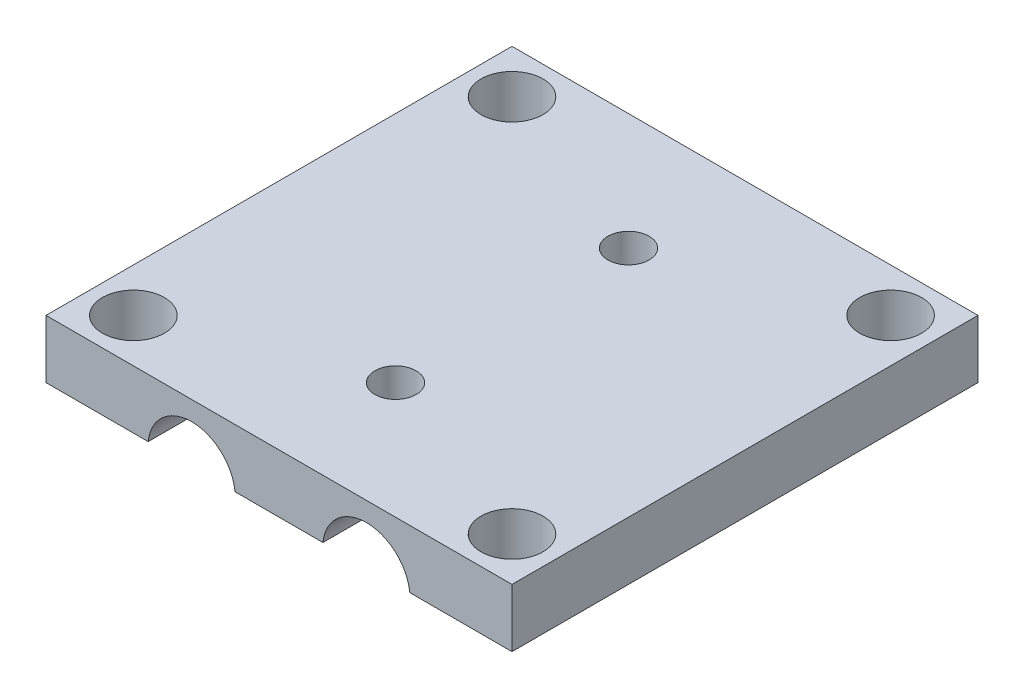
ISO-10303-21;
HEADER;
FILE_DESCRIPTION(('STEP AP214'),'2;1');
FILE_NAME('part.step','',(''),(''),'','','');
FILE_SCHEMA(('AUTOMOTIVE_DESIGN { 1 0 10303 214 1 1 1 1 }'));
ENDSEC;
DATA;
#1=APPLICATION_CONTEXT('core data for automotive mechanical design processes');
#2=APPLICATION_PROTOCOL_DEFINITION('international standard','automotive_design',2000,#1);
#3=PRODUCT_CONTEXT('',#1,'mechanical');
#4=PRODUCT('Part','Part','',(#3));
#5=PRODUCT_RELATED_PRODUCT_CATEGORY('part','',(#4));
#6=PRODUCT_DEFINITION_FORMATION('','',#4);
#7=PRODUCT_DEFINITION_CONTEXT('part definition',#1,'design');
#8=PRODUCT_DEFINITION('design','',#6,#7);
#9=PRODUCT_DEFINITION_SHAPE('','',#8);
#10=(LENGTH_UNIT() NAMED_UNIT(*) SI_UNIT(.MILLI.,.METRE.));
#11=(NAMED_UNIT(*) PLANE_ANGLE_UNIT() SI_UNIT($,.RADIAN.));
#12=(NAMED_UNIT(*) SI_UNIT($,.STERADIAN.) SOLID_ANGLE_UNIT());
#13=UNCERTAINTY_MEASURE_WITH_UNIT(LENGTH_MEASURE(1.E-05),#10,'distance_accuracy_value','');
#14=(GEOMETRIC_REPRESENTATION_CONTEXT(3) GLOBAL_UNCERTAINTY_ASSIGNED_CONTEXT((#13)) GLOBAL_UNIT_ASSIGNED_CONTEXT((#10,
#11,#12)) REPRESENTATION_CONTEXT('',''));
#15=CARTESIAN_POINT('',(0.,0.,0.));
#16=DIRECTION('',(0.,0.,1.));
#17=DIRECTION('',(1.,0.,0.));
#18=AXIS2_PLACEMENT_3D('',#15,#16,#17);
#19=CARTESIAN_POINT('',(0.,0.,0.));
#20=DIRECTION('',(0.,1.,0.));
#21=DIRECTION('',(0.,0.,1.));
#22=AXIS2_PLACEMENT_3D('',#19,#20,#21);
#23=PLANE('',#22);
#24=CARTESIAN_POINT('',(0.,0.,-12.7));
#25=DIRECTION('',(0.,1.,0.));
#26=DIRECTION('',(0.,0.,1.));
#27=AXIS2_PLACEMENT_3D('',#24,#25,#26);
#28=CIRCLE('',#27,2.24789999999999);
#29=CARTESIAN_POINT('',(0.,0.,-10.4521));
#30=VERTEX_POINT('',#29);
#31=EDGE_CURVE('E232',#30,#30,#28,.T.);
#32=ORIENTED_EDGE('',*,*,#31,.T.);
#33=EDGE_LOOP('',(#32));
#34=FACE_BOUND('',#33,.T.);
#35=CARTESIAN_POINT('',(0.,0.,12.7));
#36=DIRECTION('',(0.,1.,0.));
#37=DIRECTION('',(0.,0.,1.));
#38=AXIS2_PLACEMENT_3D('',#35,#36,#37);
#39=CIRCLE('',#38,2.24789999999999);
#40=CARTESIAN_POINT('',(0.,0.,14.9479));
#41=VERTEX_POINT('',#40);
#42=EDGE_CURVE('E226',#41,#41,#39,.T.);
#43=ORIENTED_EDGE('',*,*,#42,.T.);
#44=EDGE_LOOP('',(#43));
#45=FACE_BOUND('',#44,.T.);
#46=DIRECTION('',(-1.,0.,0.));
#47=VECTOR('',#46,1.);
#48=CARTESIAN_POINT('',(-25.4,0.,-25.4));
#49=LINE('',#48,#47);
#50=CARTESIAN_POINT('',(4.78967084037445,0.,-25.4));
#51=VERTEX_POINT('',#50);
#52=CARTESIAN_POINT('',(-4.78967084037445,0.,-25.4));
#53=VERTEX_POINT('',#52);
#54=EDGE_CURVE('E57',#51,#53,#49,.T.);
#55=ORIENTED_EDGE('',*,*,#54,.F.);
#56=DIRECTION('',(0.,0.,1.));
#57=VECTOR('',#56,1.);
#58=CARTESIAN_POINT('',(4.78967084037445,0.,-25.4));
#59=LINE('',#58,#57);
#60=CARTESIAN_POINT('',(4.78967084037445,0.,25.4));
#61=VERTEX_POINT('',#60);
#62=EDGE_CURVE('E11',#51,#61,#59,.T.);
#63=ORIENTED_EDGE('',*,*,#62,.T.);
#64=DIRECTION('',(1.,0.,0.));
#65=VECTOR('',#64,1.);
#66=CARTESIAN_POINT('',(-25.4,0.,25.4));
#67=LINE('',#66,#65);
#68=CARTESIAN_POINT('',(-4.78967084037445,0.,25.4));
#69=VERTEX_POINT('',#68);
#70=EDGE_CURVE('E114',#69,#61,#67,.T.);
#71=ORIENTED_EDGE('',*,*,#70,.F.);
#72=DIRECTION('',(0.,0.,1.));
#73=VECTOR('',#72,1.);
#74=CARTESIAN_POINT('',(-4.78967084037445,0.,-25.4));
#75=LINE('',#74,#73);
#76=EDGE_CURVE('E147',#69,#53,#75,.F.);
#77=ORIENTED_EDGE('',*,*,#76,.T.);
#78=EDGE_LOOP('',(#55,#63,#71,#77));
#79=FACE_BOUND('',#78,.T.);
#80=ADVANCED_FACE('F35',(#34,#45,#79),#23,.F.);
#81=CARTESIAN_POINT('',(-20.6375,0.,20.6375));
#82=DIRECTION('',(0.,1.,0.));
#83=DIRECTION('',(0.,0.,1.));
#84=AXIS2_PLACEMENT_3D('',#81,#82,#83);
#85=CIRCLE('',#84,3.3782);
#86=CARTESIAN_POINT('',(-20.6375,0.,24.0157));
#87=VERTEX_POINT('',#86);
#88=EDGE_CURVE('E220',#87,#87,#85,.T.);
#89=ORIENTED_EDGE('',*,*,#88,.T.);
#90=EDGE_LOOP('',(#89));
#91=FACE_BOUND('',#90,.T.);
#92=CARTESIAN_POINT('',(-20.6375,0.,-20.6375));
#93=DIRECTION('',(0.,1.,0.));
#94=DIRECTION('',(0.,0.,1.));
#95=AXIS2_PLACEMENT_3D('',#92,#93,#94);
#96=CIRCLE('',#95,3.3782);
#97=CARTESIAN_POINT('',(-20.6375,0.,-17.2593));
#98=VERTEX_POINT('',#97);
#99=EDGE_CURVE('E214',#98,#98,#96,.T.);
#100=ORIENTED_EDGE('',*,*,#99,.T.);
#101=EDGE_LOOP('',(#100));
#102=FACE_BOUND('',#101,.T.);
#103=CARTESIAN_POINT('',(-14.2603291596255,0.,-25.4));
#104=VERTEX_POINT('',#103);
#105=CARTESIAN_POINT('',(-25.4,0.,-25.4));
#106=VERTEX_POINT('',#105);
#107=EDGE_CURVE('E129',#104,#106,#49,.T.);
#108=ORIENTED_EDGE('',*,*,#107,.F.);
#109=DIRECTION('',(0.,0.,1.));
#110=VECTOR('',#109,1.);
#111=CARTESIAN_POINT('',(-14.2603291596255,0.,-25.4));
#112=LINE('',#111,#110);
#113=CARTESIAN_POINT('',(-14.2603291596255,0.,25.4));
#114=VERTEX_POINT('',#113);
#115=EDGE_CURVE('E105',#104,#114,#112,.T.);
#116=ORIENTED_EDGE('',*,*,#115,.T.);
#117=CARTESIAN_POINT('',(-25.4,0.,25.4));
#118=VERTEX_POINT('',#117);
#119=EDGE_CURVE('E122',#118,#114,#67,.T.);
#120=ORIENTED_EDGE('',*,*,#119,.F.);
#121=DIRECTION('',(0.,0.,1.));
#122=VECTOR('',#121,1.);
#123=CARTESIAN_POINT('',(-25.4,0.,-25.4));
#124=LINE('',#123,#122);
#125=EDGE_CURVE('E120',#106,#118,#124,.T.);
#126=ORIENTED_EDGE('',*,*,#125,.F.);
#127=EDGE_LOOP('',(#108,#116,#120,#126));
#128=FACE_BOUND('',#127,.T.);
#129=ADVANCED_FACE('F153',(#91,#102,#128),#23,.F.);
#130=CARTESIAN_POINT('',(-25.4,6.35,-25.4));
#131=DIRECTION('',(1.,0.,0.));
#132=DIRECTION('',(0.,0.,-1.));
#133=AXIS2_PLACEMENT_3D('',#130,#131,#132);
#134=PLANE('',#133);
#135=ORIENTED_EDGE('',*,*,#125,.T.);
#136=DIRECTION('',(0.,-1.,0.));
#137=VECTOR('',#136,1.);
#138=CARTESIAN_POINT('',(-25.4,6.35,25.4));
#139=LINE('',#138,#137);
#140=CARTESIAN_POINT('',(-25.4,6.35,25.4));
#141=VERTEX_POINT('',#140);
#142=EDGE_CURVE('E145',#141,#118,#139,.T.);
#143=ORIENTED_EDGE('',*,*,#142,.F.);
#144=DIRECTION('',(0.,0.,1.));
#145=VECTOR('',#144,1.);
#146=CARTESIAN_POINT('',(-25.4,6.35,-25.4));
#147=LINE('',#146,#145);
#148=CARTESIAN_POINT('',(-25.4,6.35,-25.4));
#149=VERTEX_POINT('',#148);
#150=EDGE_CURVE('E136',#149,#141,#147,.T.);
#151=ORIENTED_EDGE('',*,*,#150,.F.);
#152=DIRECTION('',(0.,-1.,0.));
#153=VECTOR('',#152,1.);
#154=CARTESIAN_POINT('',(-25.4,6.35,-25.4));
#155=LINE('',#154,#153);
#156=EDGE_CURVE('E137',#149,#106,#155,.T.);
#157=ORIENTED_EDGE('',*,*,#156,.T.);
#158=EDGE_LOOP('',(#135,#143,#151,#157));
#159=FACE_BOUND('',#158,.T.);
#160=ADVANCED_FACE('F37',(#159),#134,.F.);
#161=CARTESIAN_POINT('',(-25.4,6.35,25.4));
#162=DIRECTION('',(0.,0.,-1.));
#163=DIRECTION('',(-1.,0.,0.));
#164=AXIS2_PLACEMENT_3D('',#161,#162,#163);
#165=PLANE('',#164);
#166=ORIENTED_EDGE('',*,*,#70,.T.);
#167=CARTESIAN_POINT('',(9.525,-0.508,25.4));
#168=DIRECTION('',(0.,0.,1.));
#169=DIRECTION('',(1.,0.,0.));
#170=AXIS2_PLACEMENT_3D('',#167,#168,#169);
#171=CIRCLE('',#170,4.7625);
#172=CARTESIAN_POINT('',(14.2603291596256,0.,25.4));
#173=VERTEX_POINT('',#172);
#174=EDGE_CURVE('E100',#173,#61,#171,.T.);
#175=ORIENTED_EDGE('',*,*,#174,.F.);
#176=CARTESIAN_POINT('',(25.4,0.,25.4));
#177=VERTEX_POINT('',#176);
#178=EDGE_CURVE('E110',#173,#177,#67,.T.);
#179=ORIENTED_EDGE('',*,*,#178,.T.);
#180=DIRECTION('',(0.,-1.,0.));
#181=VECTOR('',#180,1.);
#182=CARTESIAN_POINT('',(25.4,6.35,25.4));
#183=LINE('',#182,#181);
#184=CARTESIAN_POINT('',(25.4,6.35,25.4));
#185=VERTEX_POINT('',#184);
#186=EDGE_CURVE('E143',#185,#177,#183,.T.);
#187=ORIENTED_EDGE('',*,*,#186,.F.);
#188=DIRECTION('',(1.,0.,0.));
#189=VECTOR('',#188,1.);
#190=CARTESIAN_POINT('',(-25.4,6.35,25.4));
#191=LINE('',#190,#189);
#192=EDGE_CURVE('E166',#141,#185,#191,.T.);
#193=ORIENTED_EDGE('',*,*,#192,.F.);
#194=ORIENTED_EDGE('',*,*,#142,.T.);
#195=ORIENTED_EDGE('',*,*,#119,.T.);
#196=CARTESIAN_POINT('',(-9.525,-0.508,25.4));
#197=DIRECTION('',(0.,0.,1.));
#198=DIRECTION('',(1.,0.,0.));
#199=AXIS2_PLACEMENT_3D('',#196,#197,#198);
#200=CIRCLE('',#199,4.7625);
#201=EDGE_CURVE('E157',#69,#114,#200,.T.);
#202=ORIENTED_EDGE('',*,*,#201,.F.);
#203=EDGE_LOOP('',(#166,#175,#179,#187,#193,#194,#195,#202));
#204=FACE_BOUND('',#203,.T.);
#205=ADVANCED_FACE('F108',(#204),#165,.F.);
#206=CARTESIAN_POINT('',(25.4,6.35,-25.4));
#207=DIRECTION('',(-1.,0.,0.));
#208=DIRECTION('',(0.,0.,1.));
#209=AXIS2_PLACEMENT_3D('',#206,#207,#208);
#210=PLANE('',#209);
#211=DIRECTION('',(0.,0.,-1.));
#212=VECTOR('',#211,1.);
#213=CARTESIAN_POINT('',(25.4,0.,-25.4));
#214=LINE('',#213,#212);
#215=CARTESIAN_POINT('',(25.4,0.,-25.4));
#216=VERTEX_POINT('',#215);
#217=EDGE_CURVE('E119',#177,#216,#214,.T.);
#218=ORIENTED_EDGE('',*,*,#217,.T.);
#219=DIRECTION('',(0.,-1.,0.));
#220=VECTOR('',#219,1.);
#221=CARTESIAN_POINT('',(25.4,6.35,-25.4));
#222=LINE('',#221,#220);
#223=CARTESIAN_POINT('',(25.4,6.35,-25.4));
#224=VERTEX_POINT('',#223);
#225=EDGE_CURVE('E140',#224,#216,#222,.T.);
#226=ORIENTED_EDGE('',*,*,#225,.F.);
#227=DIRECTION('',(0.,0.,-1.));
#228=VECTOR('',#227,1.);
#229=CARTESIAN_POINT('',(25.4,6.35,-25.4));
#230=LINE('',#229,#228);
#231=EDGE_CURVE('E168',#185,#224,#230,.T.);
#232=ORIENTED_EDGE('',*,*,#231,.F.);
#233=ORIENTED_EDGE('',*,*,#186,.T.);
#234=EDGE_LOOP('',(#218,#226,#232,#233));
#235=FACE_BOUND('',#234,.T.);
#236=ADVANCED_FACE('F177',(#235),#210,.F.);
#237=CARTESIAN_POINT('',(-25.4,6.35,-25.4));
#238=DIRECTION('',(0.,0.,1.));
#239=DIRECTION('',(1.,0.,0.));
#240=AXIS2_PLACEMENT_3D('',#237,#238,#239);
#241=PLANE('',#240);
#242=CARTESIAN_POINT('',(14.2603291596256,0.,-25.4));
#243=VERTEX_POINT('',#242);
#244=EDGE_CURVE('E134',#216,#243,#49,.T.);
#245=ORIENTED_EDGE('',*,*,#244,.T.);
#246=CARTESIAN_POINT('',(9.525,-0.508,-25.4));
#247=DIRECTION('',(0.,0.,1.));
#248=DIRECTION('',(1.,0.,0.));
#249=AXIS2_PLACEMENT_3D('',#246,#247,#248);
#250=CIRCLE('',#249,4.7625);
#251=EDGE_CURVE('E50',#243,#51,#250,.T.);
#252=ORIENTED_EDGE('',*,*,#251,.T.);
#253=ORIENTED_EDGE('',*,*,#54,.T.);
#254=CARTESIAN_POINT('',(-9.525,-0.508,-25.4));
#255=DIRECTION('',(0.,0.,1.));
#256=DIRECTION('',(1.,0.,0.));
#257=AXIS2_PLACEMENT_3D('',#254,#255,#256);
#258=CIRCLE('',#257,4.7625);
#259=EDGE_CURVE('E124',#53,#104,#258,.T.);
#260=ORIENTED_EDGE('',*,*,#259,.T.);
#261=ORIENTED_EDGE('',*,*,#107,.T.);
#262=ORIENTED_EDGE('',*,*,#156,.F.);
#263=DIRECTION('',(-1.,0.,0.));
#264=VECTOR('',#263,1.);
#265=CARTESIAN_POINT('',(-25.4,6.35,-25.4));
#266=LINE('',#265,#264);
#267=EDGE_CURVE('E141',#224,#149,#266,.T.);
#268=ORIENTED_EDGE('',*,*,#267,.F.);
#269=ORIENTED_EDGE('',*,*,#225,.T.);
#270=EDGE_LOOP('',(#245,#252,#253,#260,#261,#262,#268,#269));
#271=FACE_BOUND('',#270,.T.);
#272=ADVANCED_FACE('F158',(#271),#241,.F.);
#273=CARTESIAN_POINT('',(0.,6.35,0.));
#274=DIRECTION('',(0.,1.,0.));
#275=DIRECTION('',(0.,0.,1.));
#276=AXIS2_PLACEMENT_3D('',#273,#274,#275);
#277=PLANE('',#276);
#278=CARTESIAN_POINT('',(0.,6.35,-12.7));
#279=DIRECTION('',(0.,1.,0.));
#280=DIRECTION('',(0.,0.,1.));
#281=AXIS2_PLACEMENT_3D('',#278,#279,#280);
#282=CIRCLE('',#281,2.24789999999999);
#283=CARTESIAN_POINT('',(0.,6.35,-10.4521));
#284=VERTEX_POINT('',#283);
#285=EDGE_CURVE('E234',#284,#284,#282,.T.);
#286=ORIENTED_EDGE('',*,*,#285,.F.);
#287=EDGE_LOOP('',(#286));
#288=FACE_BOUND('',#287,.T.);
#289=CARTESIAN_POINT('',(0.,6.35,12.7));
#290=DIRECTION('',(0.,1.,0.));
#291=DIRECTION('',(0.,0.,1.));
#292=AXIS2_PLACEMENT_3D('',#289,#290,#291);
#293=CIRCLE('',#292,2.24789999999999);
#294=CARTESIAN_POINT('',(0.,6.35,14.9479));
#295=VERTEX_POINT('',#294);
#296=EDGE_CURVE('E229',#295,#295,#293,.T.);
#297=ORIENTED_EDGE('',*,*,#296,.F.);
#298=EDGE_LOOP('',(#297));
#299=FACE_BOUND('',#298,.T.);
#300=CARTESIAN_POINT('',(-20.6375,6.35,20.6375));
#301=DIRECTION('',(0.,1.,0.));
#302=DIRECTION('',(0.,0.,1.));
#303=AXIS2_PLACEMENT_3D('',#300,#301,#302);
#304=CIRCLE('',#303,3.3782);
#305=CARTESIAN_POINT('',(-20.6375,6.35,24.0157));
#306=VERTEX_POINT('',#305);
#307=EDGE_CURVE('E223',#306,#306,#304,.T.);
#308=ORIENTED_EDGE('',*,*,#307,.F.);
#309=EDGE_LOOP('',(#308));
#310=FACE_BOUND('',#309,.T.);
#311=CARTESIAN_POINT('',(-20.6375,6.35,-20.6375));
#312=DIRECTION('',(0.,1.,0.));
#313=DIRECTION('',(0.,0.,1.));
#314=AXIS2_PLACEMENT_3D('',#311,#312,#313);
#315=CIRCLE('',#314,3.3782);
#316=CARTESIAN_POINT('',(-20.6375,6.35,-17.2593));
#317=VERTEX_POINT('',#316);
#318=EDGE_CURVE('E217',#317,#317,#315,.T.);
#319=ORIENTED_EDGE('',*,*,#318,.F.);
#320=EDGE_LOOP('',(#319));
#321=FACE_BOUND('',#320,.T.);
#322=CARTESIAN_POINT('',(20.6375,6.35,-20.6375));
#323=DIRECTION('',(0.,1.,0.));
#324=DIRECTION('',(0.,0.,1.));
#325=AXIS2_PLACEMENT_3D('',#322,#323,#324);
#326=CIRCLE('',#325,3.3782);
#327=CARTESIAN_POINT('',(20.6375,6.35,-17.2593));
#328=VERTEX_POINT('',#327);
#329=EDGE_CURVE('E211',#328,#328,#326,.T.);
#330=ORIENTED_EDGE('',*,*,#329,.F.);
#331=EDGE_LOOP('',(#330));
#332=FACE_BOUND('',#331,.T.);
#333=CARTESIAN_POINT('',(20.6375,6.35,20.6375));
#334=DIRECTION('',(0.,1.,0.));
#335=DIRECTION('',(0.,0.,1.));
#336=AXIS2_PLACEMENT_3D('',#333,#334,#335);
#337=CIRCLE('',#336,3.3782);
#338=CARTESIAN_POINT('',(20.6375,6.35,24.0157));
#339=VERTEX_POINT('',#338);
#340=EDGE_CURVE('E205',#339,#339,#337,.T.);
#341=ORIENTED_EDGE('',*,*,#340,.F.);
#342=EDGE_LOOP('',(#341));
#343=FACE_BOUND('',#342,.T.);
#344=ORIENTED_EDGE('',*,*,#150,.T.);
#345=ORIENTED_EDGE('',*,*,#192,.T.);
#346=ORIENTED_EDGE('',*,*,#231,.T.);
#347=ORIENTED_EDGE('',*,*,#267,.T.);
#348=EDGE_LOOP('',(#344,#345,#346,#347));
#349=FACE_BOUND('',#348,.T.);
#350=ADVANCED_FACE('F172',(#288,#299,#310,#321,#332,#343,#349),#277,.T.);
#351=CARTESIAN_POINT('',(20.6375,0.,-20.6375));
#352=DIRECTION('',(0.,1.,0.));
#353=DIRECTION('',(0.,0.,1.));
#354=AXIS2_PLACEMENT_3D('',#351,#352,#353);
#355=CIRCLE('',#354,3.3782);
#356=CARTESIAN_POINT('',(20.6375,0.,-17.2593));
#357=VERTEX_POINT('',#356);
#358=EDGE_CURVE('E201',#357,#357,#355,.T.);
#359=ORIENTED_EDGE('',*,*,#358,.T.);
#360=EDGE_LOOP('',(#359));
#361=FACE_BOUND('',#360,.T.);
#362=CARTESIAN_POINT('',(20.6375,0.,20.6375));
#363=DIRECTION('',(0.,1.,0.));
#364=DIRECTION('',(0.,0.,1.));
#365=AXIS2_PLACEMENT_3D('',#362,#363,#364);
#366=CIRCLE('',#365,3.3782);
#367=CARTESIAN_POINT('',(20.6375,0.,24.0157));
#368=VERTEX_POINT('',#367);
#369=EDGE_CURVE('E115',#368,#368,#366,.T.);
#370=ORIENTED_EDGE('',*,*,#369,.T.);
#371=EDGE_LOOP('',(#370));
#372=FACE_BOUND('',#371,.T.);
#373=ORIENTED_EDGE('',*,*,#178,.F.);
#374=DIRECTION('',(0.,0.,1.));
#375=VECTOR('',#374,1.);
#376=CARTESIAN_POINT('',(14.2603291596256,0.,-25.4));
#377=LINE('',#376,#375);
#378=EDGE_CURVE('E43',#173,#243,#377,.F.);
#379=ORIENTED_EDGE('',*,*,#378,.T.);
#380=ORIENTED_EDGE('',*,*,#244,.F.);
#381=ORIENTED_EDGE('',*,*,#217,.F.);
#382=EDGE_LOOP('',(#373,#379,#380,#381));
#383=FACE_BOUND('',#382,.T.);
#384=ADVANCED_FACE('F118',(#361,#372,#383),#23,.F.);
#385=CARTESIAN_POINT('',(-9.525,-0.508,-25.4));
#386=DIRECTION('',(0.,0.,1.));
#387=DIRECTION('',(1.,0.,0.));
#388=AXIS2_PLACEMENT_3D('',#385,#386,#387);
#389=CYLINDRICAL_SURFACE('',#388,4.7625);
#390=ORIENTED_EDGE('',*,*,#259,.F.);
#391=ORIENTED_EDGE('',*,*,#76,.F.);
#392=ORIENTED_EDGE('',*,*,#201,.T.);
#393=ORIENTED_EDGE('',*,*,#115,.F.);
#394=EDGE_LOOP('',(#390,#391,#392,#393));
#395=FACE_BOUND('',#394,.T.);
#396=ADVANCED_FACE('F156',(#395),#389,.F.);
#397=CARTESIAN_POINT('',(9.525,-0.508,-25.4));
#398=DIRECTION('',(0.,0.,1.));
#399=DIRECTION('',(1.,0.,0.));
#400=AXIS2_PLACEMENT_3D('',#397,#398,#399);
#401=CYLINDRICAL_SURFACE('',#400,4.7625);
#402=ORIENTED_EDGE('',*,*,#251,.F.);
#403=ORIENTED_EDGE('',*,*,#378,.F.);
#404=ORIENTED_EDGE('',*,*,#174,.T.);
#405=ORIENTED_EDGE('',*,*,#62,.F.);
#406=EDGE_LOOP('',(#402,#403,#404,#405));
#407=FACE_BOUND('',#406,.T.);
#408=ADVANCED_FACE('F99',(#407),#401,.F.);
#409=CARTESIAN_POINT('',(20.6375,6.35,20.6375));
#410=DIRECTION('',(0.,1.,0.));
#411=DIRECTION('',(0.,0.,1.));
#412=AXIS2_PLACEMENT_3D('',#409,#410,#411);
#413=CYLINDRICAL_SURFACE('',#412,3.3782);
#414=ORIENTED_EDGE('',*,*,#369,.F.);
#415=EDGE_LOOP('',(#414));
#416=FACE_BOUND('',#415,.T.);
#417=ORIENTED_EDGE('',*,*,#340,.T.);
#418=EDGE_LOOP('',(#417));
#419=FACE_BOUND('',#418,.T.);
#420=ADVANCED_FACE('F250',(#416,#419),#413,.F.);
#421=CARTESIAN_POINT('',(20.6375,6.35,-20.6375));
#422=DIRECTION('',(0.,1.,0.));
#423=DIRECTION('',(0.,0.,1.));
#424=AXIS2_PLACEMENT_3D('',#421,#422,#423);
#425=CYLINDRICAL_SURFACE('',#424,3.3782);
#426=ORIENTED_EDGE('',*,*,#358,.F.);
#427=EDGE_LOOP('',(#426));
#428=FACE_BOUND('',#427,.T.);
#429=ORIENTED_EDGE('',*,*,#329,.T.);
#430=EDGE_LOOP('',(#429));
#431=FACE_BOUND('',#430,.T.);
#432=ADVANCED_FACE('F252',(#428,#431),#425,.F.);
#433=CARTESIAN_POINT('',(-20.6375,6.35,-20.6375));
#434=DIRECTION('',(0.,1.,0.));
#435=DIRECTION('',(0.,0.,1.));
#436=AXIS2_PLACEMENT_3D('',#433,#434,#435);
#437=CYLINDRICAL_SURFACE('',#436,3.3782);
#438=ORIENTED_EDGE('',*,*,#99,.F.);
#439=EDGE_LOOP('',(#438));
#440=FACE_BOUND('',#439,.T.);
#441=ORIENTED_EDGE('',*,*,#318,.T.);
#442=EDGE_LOOP('',(#441));
#443=FACE_BOUND('',#442,.T.);
#444=ADVANCED_FACE('F258',(#440,#443),#437,.F.);
#445=CARTESIAN_POINT('',(-20.6375,6.35,20.6375));
#446=DIRECTION('',(0.,1.,0.));
#447=DIRECTION('',(0.,0.,1.));
#448=AXIS2_PLACEMENT_3D('',#445,#446,#447);
#449=CYLINDRICAL_SURFACE('',#448,3.3782);
#450=ORIENTED_EDGE('',*,*,#88,.F.);
#451=EDGE_LOOP('',(#450));
#452=FACE_BOUND('',#451,.T.);
#453=ORIENTED_EDGE('',*,*,#307,.T.);
#454=EDGE_LOOP('',(#453));
#455=FACE_BOUND('',#454,.T.);
#456=ADVANCED_FACE('F265',(#452,#455),#449,.F.);
#457=CARTESIAN_POINT('',(0.,6.35,12.7));
#458=DIRECTION('',(0.,1.,0.));
#459=DIRECTION('',(0.,0.,1.));
#460=AXIS2_PLACEMENT_3D('',#457,#458,#459);
#461=CYLINDRICAL_SURFACE('',#460,2.24789999999999);
#462=ORIENTED_EDGE('',*,*,#42,.F.);
#463=EDGE_LOOP('',(#462));
#464=FACE_BOUND('',#463,.T.);
#465=ORIENTED_EDGE('',*,*,#296,.T.);
#466=EDGE_LOOP('',(#465));
#467=FACE_BOUND('',#466,.T.);
#468=ADVANCED_FACE('F269',(#464,#467),#461,.F.);
#469=CARTESIAN_POINT('',(0.,6.35,-12.7));
#470=DIRECTION('',(0.,1.,0.));
#471=DIRECTION('',(0.,0.,1.));
#472=AXIS2_PLACEMENT_3D('',#469,#470,#471);
#473=CYLINDRICAL_SURFACE('',#472,2.24789999999999);
#474=ORIENTED_EDGE('',*,*,#31,.F.);
#475=EDGE_LOOP('',(#474));
#476=FACE_BOUND('',#475,.T.);
#477=ORIENTED_EDGE('',*,*,#285,.T.);
#478=EDGE_LOOP('',(#477));
#479=FACE_BOUND('',#478,.T.);
#480=ADVANCED_FACE('F238',(#476,#479),#473,.F.);
#481=CLOSED_SHELL('',(#80,#129,#160,#205,#236,#272,#350,#384,#396,#408,#420,#432,#444,#456,#468,#480));
#482=MANIFOLD_SOLID_BREP('B2',#481);
#483=ADVANCED_BREP_SHAPE_REPRESENTATION('',(#18,#482),#14);
#484=SHAPE_DEFINITION_REPRESENTATION(#9,#483);
ENDSEC;
END-ISO-10303-21;
